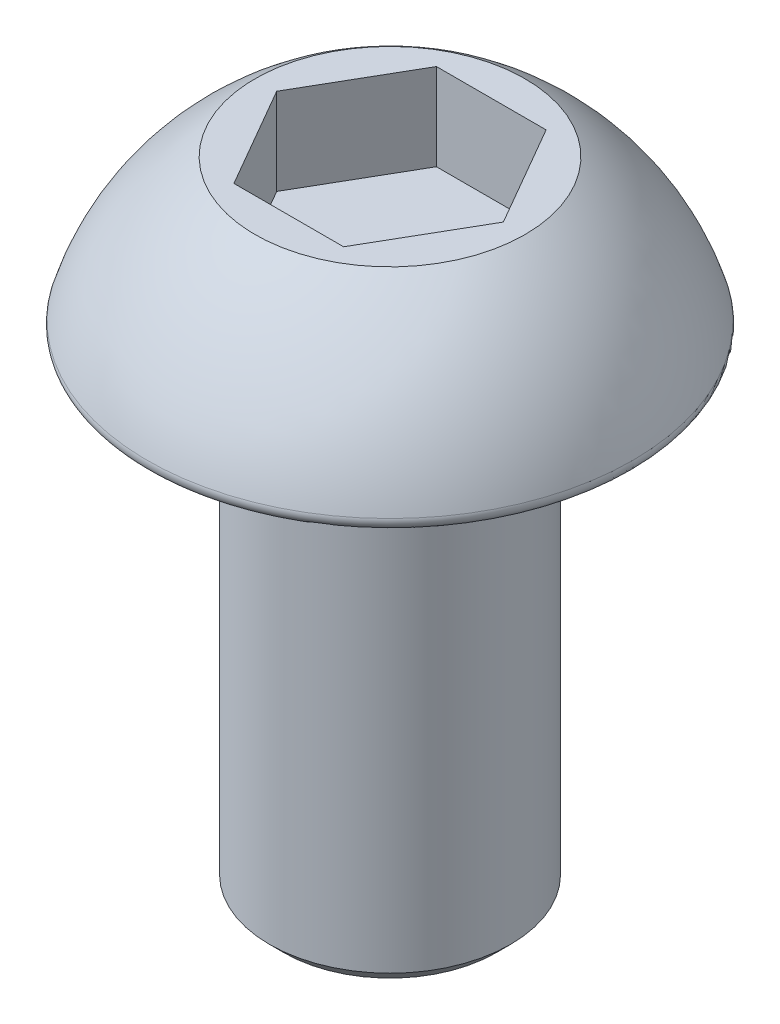
ISO-10303-21;
HEADER;
FILE_DESCRIPTION(('STEP AP214'),'2;1');
FILE_NAME('part.step','',(''),(''),'','','');
FILE_SCHEMA(('AUTOMOTIVE_DESIGN { 1 0 10303 214 1 1 1 1 }'));
ENDSEC;
DATA;
#1=APPLICATION_CONTEXT('core data for automotive mechanical design processes');
#2=APPLICATION_PROTOCOL_DEFINITION('international standard','automotive_design',2000,#1);
#3=PRODUCT_CONTEXT('',#1,'mechanical');
#4=PRODUCT('Part','Part','',(#3));
#5=PRODUCT_RELATED_PRODUCT_CATEGORY('part','',(#4));
#6=PRODUCT_DEFINITION_FORMATION('','',#4);
#7=PRODUCT_DEFINITION_CONTEXT('part definition',#1,'design');
#8=PRODUCT_DEFINITION('design','',#6,#7);
#9=PRODUCT_DEFINITION_SHAPE('','',#8);
#10=(LENGTH_UNIT() NAMED_UNIT(*) SI_UNIT(.MILLI.,.METRE.));
#11=(NAMED_UNIT(*) PLANE_ANGLE_UNIT() SI_UNIT($,.RADIAN.));
#12=(NAMED_UNIT(*) SI_UNIT($,.STERADIAN.) SOLID_ANGLE_UNIT());
#13=UNCERTAINTY_MEASURE_WITH_UNIT(LENGTH_MEASURE(1.E-05),#10,'distance_accuracy_value','');
#14=(GEOMETRIC_REPRESENTATION_CONTEXT(3) GLOBAL_UNCERTAINTY_ASSIGNED_CONTEXT((#13)) GLOBAL_UNIT_ASSIGNED_CONTEXT((#10,
#11,#12)) REPRESENTATION_CONTEXT('',''));
#15=CARTESIAN_POINT('',(0.,0.,0.));
#16=DIRECTION('',(0.,0.,1.));
#17=DIRECTION('',(1.,0.,0.));
#18=AXIS2_PLACEMENT_3D('',#15,#16,#17);
#19=CARTESIAN_POINT('',(0.,-13.2,0.));
#20=DIRECTION('',(0.,-1.,0.));
#21=DIRECTION('',(0.,0.,-1.));
#22=AXIS2_PLACEMENT_3D('',#19,#20,#21);
#23=PLANE('',#22);
#24=CARTESIAN_POINT('',(0.,-13.2,0.));
#25=DIRECTION('',(0.,1.,0.));
#26=DIRECTION('',(-1.,0.,0.));
#27=AXIS2_PLACEMENT_3D('',#24,#25,#26);
#28=CIRCLE('',#27,2.2);
#29=CARTESIAN_POINT('',(-2.2,-13.2,0.));
#30=VERTEX_POINT('',#29);
#31=EDGE_CURVE('E11',#30,#30,#28,.T.);
#32=ORIENTED_EDGE('',*,*,#31,.F.);
#33=EDGE_LOOP('',(#32));
#34=FACE_BOUND('',#33,.T.);
#35=ADVANCED_FACE('F17',(#34),#23,.T.);
#36=CARTESIAN_POINT('',(0.,-13.05,0.));
#37=DIRECTION('',(0.,1.,0.));
#38=DIRECTION('',(1.,0.,0.));
#39=AXIS2_PLACEMENT_3D('',#36,#37,#38);
#40=CONICAL_SURFACE('',#39,2.35,0.785398163397448);
#41=CARTESIAN_POINT('',(0.,-12.9,0.));
#42=DIRECTION('',(0.,1.,0.));
#43=DIRECTION('',(-1.,0.,0.));
#44=AXIS2_PLACEMENT_3D('',#41,#42,#43);
#45=CIRCLE('',#44,2.5);
#46=CARTESIAN_POINT('',(2.5,-12.9,0.));
#47=VERTEX_POINT('',#46);
#48=EDGE_CURVE('E180',#47,#47,#45,.T.);
#49=ORIENTED_EDGE('',*,*,#48,.F.);
#50=EDGE_LOOP('',(#49));
#51=FACE_BOUND('',#50,.T.);
#52=ORIENTED_EDGE('',*,*,#31,.T.);
#53=EDGE_LOOP('',(#52));
#54=FACE_BOUND('',#53,.T.);
#55=ADVANCED_FACE('F242',(#51,#54),#40,.T.);
#56=CARTESIAN_POINT('',(0.,0.66,0.));
#57=DIRECTION('',(0.,-1.,0.));
#58=DIRECTION('',(-1.,0.,0.));
#59=AXIS2_PLACEMENT_3D('',#56,#57,#58);
#60=CYLINDRICAL_SURFACE('',#59,2.5);
#61=ORIENTED_EDGE('',*,*,#48,.T.);
#62=DIRECTION('',(0.,1.,0.));
#63=VECTOR('',#62,1.);
#64=CARTESIAN_POINT('',(2.5,0.66,0.));
#65=LINE('',#64,#63);
#66=CARTESIAN_POINT('',(2.5,-3.2,0.));
#67=VERTEX_POINT('',#66);
#68=EDGE_CURVE('E28',#47,#67,#65,.T.);
#69=ORIENTED_EDGE('',*,*,#68,.T.);
#70=CARTESIAN_POINT('',(0.,-3.2,0.));
#71=DIRECTION('',(0.,-1.,0.));
#72=DIRECTION('',(-1.,0.,0.));
#73=AXIS2_PLACEMENT_3D('',#70,#71,#72);
#74=CIRCLE('',#73,2.5);
#75=EDGE_CURVE('E184',#67,#67,#74,.T.);
#76=ORIENTED_EDGE('',*,*,#75,.T.);
#77=ORIENTED_EDGE('',*,*,#68,.F.);
#78=EDGE_LOOP('',(#61,#69,#76,#77));
#79=FACE_BOUND('',#78,.T.);
#80=ADVANCED_FACE('F19',(#79),#60,.T.);
#81=CARTESIAN_POINT('',(0.,-3.2,0.));
#82=DIRECTION('',(0.,-1.,0.));
#83=DIRECTION('',(0.,0.,-1.));
#84=AXIS2_PLACEMENT_3D('',#81,#82,#83);
#85=PLANE('',#84);
#86=ORIENTED_EDGE('',*,*,#75,.F.);
#87=EDGE_LOOP('',(#86));
#88=FACE_BOUND('',#87,.T.);
#89=CARTESIAN_POINT('',(0.,-3.2,0.));
#90=DIRECTION('',(0.,-1.,0.));
#91=DIRECTION('',(-1.,0.,0.));
#92=AXIS2_PLACEMENT_3D('',#89,#90,#91);
#93=CIRCLE('',#92,4.838907870448);
#94=CARTESIAN_POINT('',(4.83878746001059,-3.2,-0.0341364252359273));
#95=VERTEX_POINT('',#94);
#96=EDGE_CURVE('E178',#95,#95,#93,.T.);
#97=ORIENTED_EDGE('',*,*,#96,.T.);
#98=EDGE_LOOP('',(#97));
#99=FACE_BOUND('',#98,.T.);
#100=ADVANCED_FACE('F258',(#88,#99),#85,.T.);
#101=CARTESIAN_POINT('',(0.,-3.,0.));
#102=DIRECTION('',(0.,-1.,0.));
#103=DIRECTION('',(-0.999975116195506,0.,0.00705457226090304));
#104=AXIS2_PLACEMENT_3D('',#101,#102,#103);
#105=TOROIDAL_SURFACE('',#104,4.838908064795,0.2);
#106=ORIENTED_EDGE('',*,*,#96,.F.);
#107=CARTESIAN_POINT('',(4.83878765435275,-3.,-0.0341364266069622));
#108=DIRECTION('',(0.00705457226090292,0.,0.999975116195506));
#109=DIRECTION('',(0.999975116195506,0.,-0.00705457226090292));
#110=AXIS2_PLACEMENT_3D('',#107,#108,#109);
#111=CIRCLE('',#110,0.2);
#112=CARTESIAN_POINT('',(5.03048507003604,-2.9429888441,-0.0354888035304113));
#113=VERTEX_POINT('',#112);
#114=EDGE_CURVE('E89',#95,#113,#111,.T.);
#115=ORIENTED_EDGE('',*,*,#114,.T.);
#116=CARTESIAN_POINT('',(0.,-2.9429888441,0.));
#117=DIRECTION('',(0.,-1.,0.));
#118=DIRECTION('',(-1.,0.,0.));
#119=AXIS2_PLACEMENT_3D('',#116,#117,#118);
#120=CIRCLE('',#119,5.030610250758);
#121=CARTESIAN_POINT('',(5.030610250758,-2.9429888441,0.));
#122=VERTEX_POINT('',#121);
#123=EDGE_CURVE('E81',#113,#122,#120,.T.);
#124=ORIENTED_EDGE('',*,*,#123,.T.);
#125=CARTESIAN_POINT('',(0.,-2.9429888441,0.));
#126=DIRECTION('',(0.,-1.,0.));
#127=DIRECTION('',(-1.,0.,0.));
#128=AXIS2_PLACEMENT_3D('',#125,#126,#127);
#129=CIRCLE('',#128,5.030610250758);
#130=EDGE_CURVE('E169',#122,#113,#129,.T.);
#131=ORIENTED_EDGE('',*,*,#130,.T.);
#132=ORIENTED_EDGE('',*,*,#114,.F.);
#133=EDGE_LOOP('',(#106,#115,#124,#131,#132));
#134=FACE_BOUND('',#133,.T.);
#135=ADVANCED_FACE('F255',(#134),#105,.T.);
#136=CARTESIAN_POINT('',(0.,-4.4390625,0.));
#137=DIRECTION('',(0.,-1.,0.));
#138=DIRECTION('',(-1.,0.,0.));
#139=AXIS2_PLACEMENT_3D('',#136,#137,#138);
#140=SPHERICAL_SURFACE('',#139,5.24835935116);
#141=ORIENTED_EDGE('',*,*,#130,.F.);
#142=CARTESIAN_POINT('',(0.,-4.4390625,0.));
#143=DIRECTION('',(0.,0.,1.));
#144=DIRECTION('',(1.,0.,0.));
#145=AXIS2_PLACEMENT_3D('',#142,#143,#144);
#146=CIRCLE('',#145,5.24835935116);
#147=CARTESIAN_POINT('',(2.8,0.,0.));
#148=VERTEX_POINT('',#147);
#149=EDGE_CURVE('E179',#122,#148,#146,.T.);
#150=ORIENTED_EDGE('',*,*,#149,.T.);
#151=CARTESIAN_POINT('',(0.,0.,0.));
#152=DIRECTION('',(0.,-1.,0.));
#153=DIRECTION('',(-1.,0.,0.));
#154=AXIS2_PLACEMENT_3D('',#151,#152,#153);
#155=CIRCLE('',#154,2.8);
#156=EDGE_CURVE('E209',#148,#148,#155,.T.);
#157=ORIENTED_EDGE('',*,*,#156,.T.);
#158=ORIENTED_EDGE('',*,*,#149,.F.);
#159=ORIENTED_EDGE('',*,*,#123,.F.);
#160=EDGE_LOOP('',(#141,#150,#157,#158,#159));
#161=FACE_BOUND('',#160,.T.);
#162=ADVANCED_FACE('F229',(#161),#140,.T.);
#163=CARTESIAN_POINT('',(0.,-1.8,0.));
#164=DIRECTION('',(0.,1.,0.));
#165=DIRECTION('',(1.,0.,0.));
#166=AXIS2_PLACEMENT_3D('',#163,#164,#165);
#167=PLANE('',#166);
#168=DIRECTION('',(-0.500000000000017,0.,0.866025403784429));
#169=VECTOR('',#168,1.);
#170=CARTESIAN_POINT('',(-1.137564434702,-1.8,-2.1));
#171=LINE('',#170,#169);
#172=CARTESIAN_POINT('',(-1.137564434702,-1.8,-2.1));
#173=VERTEX_POINT('',#172);
#174=CARTESIAN_POINT('',(-2.35,-1.8,0.));
#175=VERTEX_POINT('',#174);
#176=EDGE_CURVE('E174',#173,#175,#171,.T.);
#177=ORIENTED_EDGE('',*,*,#176,.T.);
#178=DIRECTION('',(0.500000000000017,0.,0.866025403784429));
#179=VECTOR('',#178,1.);
#180=CARTESIAN_POINT('',(-2.35,-1.8,0.));
#181=LINE('',#180,#179);
#182=CARTESIAN_POINT('',(-1.137564434702,-1.8,2.1));
#183=VERTEX_POINT('',#182);
#184=EDGE_CURVE('E166',#175,#183,#181,.T.);
#185=ORIENTED_EDGE('',*,*,#184,.T.);
#186=DIRECTION('',(1.,0.,0.));
#187=VECTOR('',#186,1.);
#188=CARTESIAN_POINT('',(-1.137564434702,-1.8,2.1));
#189=LINE('',#188,#187);
#190=CARTESIAN_POINT('',(1.137564434702,-1.8,2.1));
#191=VERTEX_POINT('',#190);
#192=EDGE_CURVE('E205',#183,#191,#189,.T.);
#193=ORIENTED_EDGE('',*,*,#192,.T.);
#194=DIRECTION('',(0.500000000000017,0.,-0.866025403784429));
#195=VECTOR('',#194,1.);
#196=CARTESIAN_POINT('',(1.137564434702,-1.8,2.1));
#197=LINE('',#196,#195);
#198=CARTESIAN_POINT('',(2.35,-1.8,0.));
#199=VERTEX_POINT('',#198);
#200=EDGE_CURVE('E140',#191,#199,#197,.T.);
#201=ORIENTED_EDGE('',*,*,#200,.T.);
#202=DIRECTION('',(-0.500000000000017,0.,-0.866025403784429));
#203=VECTOR('',#202,1.);
#204=CARTESIAN_POINT('',(2.35,-1.8,0.));
#205=LINE('',#204,#203);
#206=CARTESIAN_POINT('',(1.137564434702,-1.8,-2.1));
#207=VERTEX_POINT('',#206);
#208=EDGE_CURVE('E138',#199,#207,#205,.T.);
#209=ORIENTED_EDGE('',*,*,#208,.T.);
#210=DIRECTION('',(-1.,0.,0.));
#211=VECTOR('',#210,1.);
#212=CARTESIAN_POINT('',(1.137564434702,-1.8,-2.1));
#213=LINE('',#212,#211);
#214=EDGE_CURVE('E21',#207,#173,#213,.T.);
#215=ORIENTED_EDGE('',*,*,#214,.T.);
#216=EDGE_LOOP('',(#177,#185,#193,#201,#209,#215));
#217=FACE_BOUND('',#216,.T.);
#218=ADVANCED_FACE('F265',(#217),#167,.T.);
#219=CARTESIAN_POINT('',(-2.35,-1.8,0.));
#220=DIRECTION('',(-0.866025403784429,0.,0.500000000000017));
#221=DIRECTION('',(0.,1.,0.));
#222=AXIS2_PLACEMENT_3D('',#219,#220,#221);
#223=PLANE('',#222);
#224=DIRECTION('',(0.500000000000017,0.,0.866025403784429));
#225=VECTOR('',#224,1.);
#226=CARTESIAN_POINT('',(-2.35,0.,0.));
#227=LINE('',#226,#225);
#228=CARTESIAN_POINT('',(-2.35,0.,0.));
#229=VERTEX_POINT('',#228);
#230=CARTESIAN_POINT('',(-1.137564434702,0.,2.1));
#231=VERTEX_POINT('',#230);
#232=EDGE_CURVE('E175',#229,#231,#227,.T.);
#233=ORIENTED_EDGE('',*,*,#232,.T.);
#234=DIRECTION('',(0.,1.,0.));
#235=VECTOR('',#234,1.);
#236=CARTESIAN_POINT('',(-1.137564434702,-1.8,2.1));
#237=LINE('',#236,#235);
#238=EDGE_CURVE('E115',#183,#231,#237,.T.);
#239=ORIENTED_EDGE('',*,*,#238,.F.);
#240=ORIENTED_EDGE('',*,*,#184,.F.);
#241=DIRECTION('',(0.,1.,0.));
#242=VECTOR('',#241,1.);
#243=CARTESIAN_POINT('',(-2.35,-1.8,0.));
#244=LINE('',#243,#242);
#245=EDGE_CURVE('E170',#175,#229,#244,.T.);
#246=ORIENTED_EDGE('',*,*,#245,.T.);
#247=EDGE_LOOP('',(#233,#239,#240,#246));
#248=FACE_BOUND('',#247,.T.);
#249=ADVANCED_FACE('F254',(#248),#223,.F.);
#250=CARTESIAN_POINT('',(-1.137564434702,-1.8,2.1));
#251=DIRECTION('',(0.,0.,1.));
#252=DIRECTION('',(1.,0.,0.));
#253=AXIS2_PLACEMENT_3D('',#250,#251,#252);
#254=PLANE('',#253);
#255=DIRECTION('',(1.,0.,0.));
#256=VECTOR('',#255,1.);
#257=CARTESIAN_POINT('',(-1.137564434702,0.,2.1));
#258=LINE('',#257,#256);
#259=CARTESIAN_POINT('',(1.137564434702,0.,2.1));
#260=VERTEX_POINT('',#259);
#261=EDGE_CURVE('E148',#231,#260,#258,.T.);
#262=ORIENTED_EDGE('',*,*,#261,.T.);
#263=DIRECTION('',(0.,1.,0.));
#264=VECTOR('',#263,1.);
#265=CARTESIAN_POINT('',(1.137564434702,-1.8,2.1));
#266=LINE('',#265,#264);
#267=EDGE_CURVE('E125',#191,#260,#266,.T.);
#268=ORIENTED_EDGE('',*,*,#267,.F.);
#269=ORIENTED_EDGE('',*,*,#192,.F.);
#270=ORIENTED_EDGE('',*,*,#238,.T.);
#271=EDGE_LOOP('',(#262,#268,#269,#270));
#272=FACE_BOUND('',#271,.T.);
#273=ADVANCED_FACE('F251',(#272),#254,.F.);
#274=CARTESIAN_POINT('',(1.137564434702,-1.8,2.1));
#275=DIRECTION('',(0.866025403784429,0.,0.500000000000017));
#276=DIRECTION('',(0.,-1.,0.));
#277=AXIS2_PLACEMENT_3D('',#274,#275,#276);
#278=PLANE('',#277);
#279=DIRECTION('',(0.500000000000017,0.,-0.866025403784429));
#280=VECTOR('',#279,1.);
#281=CARTESIAN_POINT('',(1.137564434702,0.,2.1));
#282=LINE('',#281,#280);
#283=CARTESIAN_POINT('',(2.35,0.,0.));
#284=VERTEX_POINT('',#283);
#285=EDGE_CURVE('E143',#260,#284,#282,.T.);
#286=ORIENTED_EDGE('',*,*,#285,.T.);
#287=DIRECTION('',(0.,1.,0.));
#288=VECTOR('',#287,1.);
#289=CARTESIAN_POINT('',(2.35,-1.8,0.));
#290=LINE('',#289,#288);
#291=EDGE_CURVE('E132',#199,#284,#290,.T.);
#292=ORIENTED_EDGE('',*,*,#291,.F.);
#293=ORIENTED_EDGE('',*,*,#200,.F.);
#294=ORIENTED_EDGE('',*,*,#267,.T.);
#295=EDGE_LOOP('',(#286,#292,#293,#294));
#296=FACE_BOUND('',#295,.T.);
#297=ADVANCED_FACE('F144',(#296),#278,.F.);
#298=CARTESIAN_POINT('',(2.35,-1.8,0.));
#299=DIRECTION('',(0.866025403784429,0.,-0.500000000000017));
#300=DIRECTION('',(0.,-1.,0.));
#301=AXIS2_PLACEMENT_3D('',#298,#299,#300);
#302=PLANE('',#301);
#303=DIRECTION('',(-0.500000000000017,0.,-0.866025403784429));
#304=VECTOR('',#303,1.);
#305=CARTESIAN_POINT('',(2.35,0.,0.));
#306=LINE('',#305,#304);
#307=CARTESIAN_POINT('',(1.137564434702,0.,-2.1));
#308=VERTEX_POINT('',#307);
#309=EDGE_CURVE('E136',#284,#308,#306,.T.);
#310=ORIENTED_EDGE('',*,*,#309,.T.);
#311=DIRECTION('',(0.,1.,0.));
#312=VECTOR('',#311,1.);
#313=CARTESIAN_POINT('',(1.137564434702,-1.8,-2.1));
#314=LINE('',#313,#312);
#315=EDGE_CURVE('E197',#207,#308,#314,.T.);
#316=ORIENTED_EDGE('',*,*,#315,.F.);
#317=ORIENTED_EDGE('',*,*,#208,.F.);
#318=ORIENTED_EDGE('',*,*,#291,.T.);
#319=EDGE_LOOP('',(#310,#316,#317,#318));
#320=FACE_BOUND('',#319,.T.);
#321=ADVANCED_FACE('F133',(#320),#302,.F.);
#322=CARTESIAN_POINT('',(1.137564434702,-1.8,-2.1));
#323=DIRECTION('',(0.,0.,-1.));
#324=DIRECTION('',(0.,-1.,0.));
#325=AXIS2_PLACEMENT_3D('',#322,#323,#324);
#326=PLANE('',#325);
#327=DIRECTION('',(-1.,0.,0.));
#328=VECTOR('',#327,1.);
#329=CARTESIAN_POINT('',(1.137564434702,0.,-2.1));
#330=LINE('',#329,#328);
#331=CARTESIAN_POINT('',(-1.137564434702,0.,-2.1));
#332=VERTEX_POINT('',#331);
#333=EDGE_CURVE('E154',#308,#332,#330,.T.);
#334=ORIENTED_EDGE('',*,*,#333,.T.);
#335=DIRECTION('',(0.,1.,0.));
#336=VECTOR('',#335,1.);
#337=CARTESIAN_POINT('',(-1.137564434702,-1.8,-2.1));
#338=LINE('',#337,#336);
#339=EDGE_CURVE('E192',#173,#332,#338,.T.);
#340=ORIENTED_EDGE('',*,*,#339,.F.);
#341=ORIENTED_EDGE('',*,*,#214,.F.);
#342=ORIENTED_EDGE('',*,*,#315,.T.);
#343=EDGE_LOOP('',(#334,#340,#341,#342));
#344=FACE_BOUND('',#343,.T.);
#345=ADVANCED_FACE('F237',(#344),#326,.F.);
#346=CARTESIAN_POINT('',(-1.137564434702,-1.8,-2.1));
#347=DIRECTION('',(-0.866025403784429,0.,-0.500000000000017));
#348=DIRECTION('',(-0.500000000000017,0.,0.866025403784429));
#349=AXIS2_PLACEMENT_3D('',#346,#347,#348);
#350=PLANE('',#349);
#351=DIRECTION('',(-0.500000000000017,0.,0.866025403784429));
#352=VECTOR('',#351,1.);
#353=CARTESIAN_POINT('',(-1.137564434702,0.,-2.1));
#354=LINE('',#353,#352);
#355=EDGE_CURVE('E161',#332,#229,#354,.T.);
#356=ORIENTED_EDGE('',*,*,#355,.T.);
#357=ORIENTED_EDGE('',*,*,#245,.F.);
#358=ORIENTED_EDGE('',*,*,#176,.F.);
#359=ORIENTED_EDGE('',*,*,#339,.T.);
#360=EDGE_LOOP('',(#356,#357,#358,#359));
#361=FACE_BOUND('',#360,.T.);
#362=ADVANCED_FACE('F231',(#361),#350,.F.);
#363=CARTESIAN_POINT('',(0.,0.,0.));
#364=DIRECTION('',(0.,-1.,0.));
#365=DIRECTION('',(0.,0.,-1.));
#366=AXIS2_PLACEMENT_3D('',#363,#364,#365);
#367=PLANE('',#366);
#368=ORIENTED_EDGE('',*,*,#355,.F.);
#369=ORIENTED_EDGE('',*,*,#333,.F.);
#370=ORIENTED_EDGE('',*,*,#309,.F.);
#371=ORIENTED_EDGE('',*,*,#285,.F.);
#372=ORIENTED_EDGE('',*,*,#261,.F.);
#373=ORIENTED_EDGE('',*,*,#232,.F.);
#374=EDGE_LOOP('',(#368,#369,#370,#371,#372,#373));
#375=FACE_BOUND('',#374,.T.);
#376=ORIENTED_EDGE('',*,*,#156,.F.);
#377=EDGE_LOOP('',(#376));
#378=FACE_BOUND('',#377,.T.);
#379=ADVANCED_FACE('F151',(#375,#378),#367,.F.);
#380=CLOSED_SHELL('',(#35,#55,#80,#100,#135,#162,#218,#249,#273,#297,#321,#345,#362,#379));
#381=MANIFOLD_SOLID_BREP('B1',#380);
#382=ADVANCED_BREP_SHAPE_REPRESENTATION('',(#18,#381),#14);
#383=SHAPE_DEFINITION_REPRESENTATION(#9,#382);
ENDSEC;
END-ISO-10303-21;
